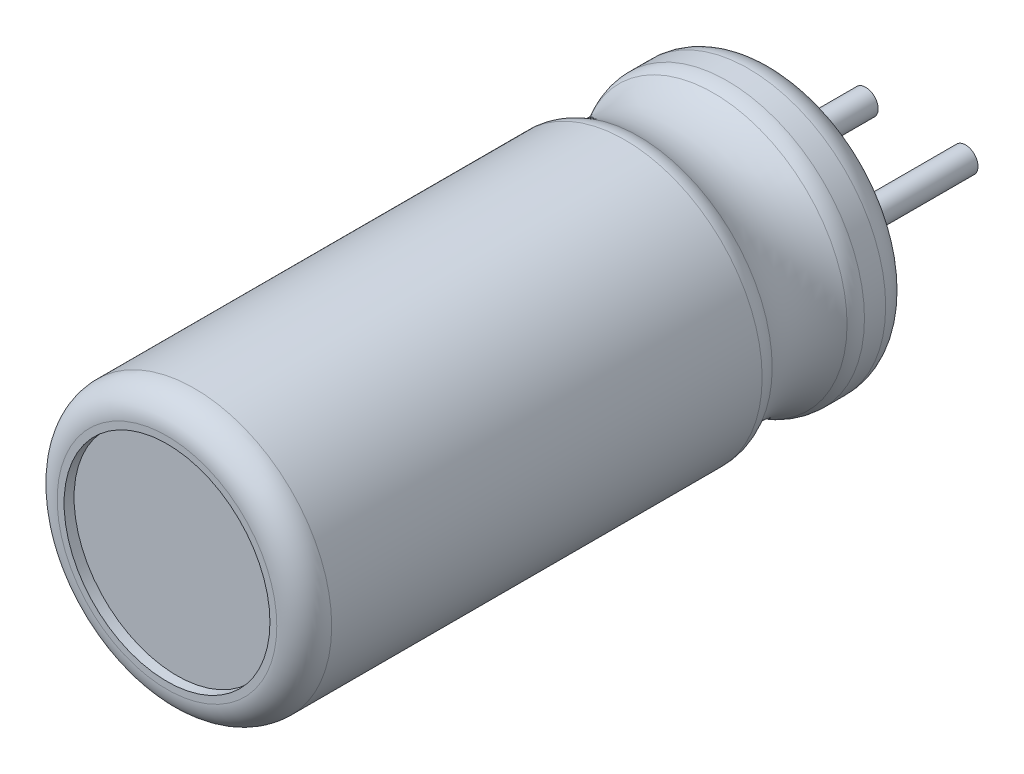
ISO-10303-21;
HEADER;
FILE_DESCRIPTION(('STEP AP214'),'2;1');
FILE_NAME('part.step','',(''),(''),'','','');
FILE_SCHEMA(('AUTOMOTIVE_DESIGN { 1 0 10303 214 1 1 1 1 }'));
ENDSEC;
DATA;
#1=APPLICATION_CONTEXT('core data for automotive mechanical design processes');
#2=APPLICATION_PROTOCOL_DEFINITION('international standard','automotive_design',2000,#1);
#3=PRODUCT_CONTEXT('',#1,'mechanical');
#4=PRODUCT('Part','Part','',(#3));
#5=PRODUCT_RELATED_PRODUCT_CATEGORY('part','',(#4));
#6=PRODUCT_DEFINITION_FORMATION('','',#4);
#7=PRODUCT_DEFINITION_CONTEXT('part definition',#1,'design');
#8=PRODUCT_DEFINITION('design','',#6,#7);
#9=PRODUCT_DEFINITION_SHAPE('','',#8);
#10=(LENGTH_UNIT() NAMED_UNIT(*) SI_UNIT(.MILLI.,.METRE.));
#11=(NAMED_UNIT(*) PLANE_ANGLE_UNIT() SI_UNIT($,.RADIAN.));
#12=(NAMED_UNIT(*) SI_UNIT($,.STERADIAN.) SOLID_ANGLE_UNIT());
#13=UNCERTAINTY_MEASURE_WITH_UNIT(LENGTH_MEASURE(1.E-05),#10,'distance_accuracy_value','');
#14=(GEOMETRIC_REPRESENTATION_CONTEXT(3) GLOBAL_UNCERTAINTY_ASSIGNED_CONTEXT((#13)) GLOBAL_UNIT_ASSIGNED_CONTEXT((#10,
#11,#12)) REPRESENTATION_CONTEXT('',''));
#15=CARTESIAN_POINT('',(0.,0.,0.));
#16=DIRECTION('',(0.,0.,1.));
#17=DIRECTION('',(1.,0.,0.));
#18=AXIS2_PLACEMENT_3D('',#15,#16,#17);
#19=CARTESIAN_POINT('',(0.,0.,0.));
#20=DIRECTION('',(0.,0.,1.));
#21=DIRECTION('',(1.,0.,0.));
#22=AXIS2_PLACEMENT_3D('',#19,#20,#21);
#23=PLANE('',#22);
#24=DIRECTION('',(0.,1.,0.));
#25=VECTOR('',#24,1.);
#26=CARTESIAN_POINT('',(0.229166666663365,0.,0.));
#27=LINE('',#26,#25);
#28=CARTESIAN_POINT('',(0.229166666665022,1.79795408419992,0.));
#29=VERTEX_POINT('',#28);
#30=CARTESIAN_POINT('',(0.229166666665021,0.669203235791981,0.));
#31=VERTEX_POINT('',#30);
#32=EDGE_CURVE('P0_E115',#29,#31,#27,.F.);
#33=ORIENTED_EDGE('',*,*,#32,.F.);
#34=CARTESIAN_POINT('',(0.,0.,0.));
#35=DIRECTION('',(0.,0.,-1.));
#36=DIRECTION('',(-1.,0.,0.));
#37=AXIS2_PLACEMENT_3D('',#34,#35,#36);
#38=CIRCLE('',#37,1.8125);
#39=CARTESIAN_POINT('',(0.229166666663365,-1.79795408419971,0.));
#40=VERTEX_POINT('',#39);
#41=EDGE_CURVE('P0_E294',#40,#29,#38,.F.);
#42=ORIENTED_EDGE('',*,*,#41,.F.);
#43=DIRECTION('',(0.,1.,0.));
#44=VECTOR('',#43,1.);
#45=CARTESIAN_POINT('',(0.229166666666678,-1.79795408425211,0.));
#46=LINE('',#45,#44);
#47=CARTESIAN_POINT('',(0.229166666666678,-0.669203235791843,0.));
#48=VERTEX_POINT('',#47);
#49=EDGE_CURVE('P0_E298',#48,#40,#46,.F.);
#50=ORIENTED_EDGE('',*,*,#49,.F.);
#51=CARTESIAN_POINT('',(0.,2.07123151783556,0.));
#52=DIRECTION('',(0.,0.,1.));
#53=DIRECTION('',(1.,0.,0.));
#54=AXIS2_PLACEMENT_3D('',#51,#52,#53);
#55=CIRCLE('',#54,2.75);
#56=CARTESIAN_POINT('',(1.19565217379121,-0.405240949063344,0.));
#57=VERTEX_POINT('',#56);
#58=EDGE_CURVE('P0_E304',#48,#57,#55,.T.);
#59=ORIENTED_EDGE('',*,*,#58,.T.);
#60=CARTESIAN_POINT('',(1.,0.,0.));
#61=DIRECTION('',(0.,0.,1.));
#62=DIRECTION('',(1.,0.,0.));
#63=AXIS2_PLACEMENT_3D('',#60,#61,#62);
#64=CIRCLE('',#63,0.45);
#65=CARTESIAN_POINT('',(1.19565217379121,0.405240949063344,0.));
#66=VERTEX_POINT('',#65);
#67=EDGE_CURVE('P0_E140',#57,#66,#64,.T.);
#68=ORIENTED_EDGE('',*,*,#67,.T.);
#69=CARTESIAN_POINT('',(0.,-2.07123151783556,0.));
#70=DIRECTION('',(0.,0.,1.));
#71=DIRECTION('',(1.,0.,0.));
#72=AXIS2_PLACEMENT_3D('',#69,#70,#71);
#73=CIRCLE('',#72,2.75);
#74=EDGE_CURVE('P0_E126',#31,#66,#73,.F.);
#75=ORIENTED_EDGE('',*,*,#74,.F.);
#76=EDGE_LOOP('',(#33,#42,#50,#59,#68,#75));
#77=FACE_BOUND('',#76,.T.);
#78=ADVANCED_FACE('P0_F16',(#77),#23,.F.);
#79=CARTESIAN_POINT('',(0.,0.,0.));
#80=DIRECTION('',(0.,0.,1.));
#81=DIRECTION('',(1.,0.,0.));
#82=AXIS2_PLACEMENT_3D('',#79,#80,#81);
#83=PLANE('',#82);
#84=CARTESIAN_POINT('',(-1.,0.,0.));
#85=DIRECTION('',(0.,0.,1.));
#86=DIRECTION('',(1.,0.,0.));
#87=AXIS2_PLACEMENT_3D('',#84,#85,#86);
#88=CIRCLE('',#87,0.45);
#89=CARTESIAN_POINT('',(-1.19565217381368,-0.405240949109878,0.));
#90=VERTEX_POINT('',#89);
#91=CARTESIAN_POINT('',(-1.19565217381368,0.405240949109878,0.));
#92=VERTEX_POINT('',#91);
#93=EDGE_CURVE('P0_E341',#90,#92,#88,.F.);
#94=ORIENTED_EDGE('',*,*,#93,.F.);
#95=CARTESIAN_POINT('',(0.,2.07123151783556,0.));
#96=DIRECTION('',(0.,0.,1.));
#97=DIRECTION('',(1.,0.,0.));
#98=AXIS2_PLACEMENT_3D('',#95,#96,#97);
#99=CIRCLE('',#98,2.75);
#100=CARTESIAN_POINT('',(-0.229166666664999,-0.669203235791983,0.));
#101=VERTEX_POINT('',#100);
#102=EDGE_CURVE('P0_E144',#101,#90,#99,.F.);
#103=ORIENTED_EDGE('',*,*,#102,.F.);
#104=DIRECTION('',(0.,1.,0.));
#105=VECTOR('',#104,1.);
#106=CARTESIAN_POINT('',(-0.229166666663342,0.,0.));
#107=LINE('',#106,#105);
#108=CARTESIAN_POINT('',(-0.229166666664999,-1.79795408419992,0.));
#109=VERTEX_POINT('',#108);
#110=EDGE_CURVE('P0_E142',#109,#101,#107,.T.);
#111=ORIENTED_EDGE('',*,*,#110,.F.);
#112=CARTESIAN_POINT('',(0.,0.,0.));
#113=DIRECTION('',(0.,0.,-1.));
#114=DIRECTION('',(-1.,0.,0.));
#115=AXIS2_PLACEMENT_3D('',#112,#113,#114);
#116=CIRCLE('',#115,1.8125);
#117=CARTESIAN_POINT('',(-0.229166666663342,1.79795408419971,0.));
#118=VERTEX_POINT('',#117);
#119=EDGE_CURVE('P0_E288',#118,#109,#116,.F.);
#120=ORIENTED_EDGE('',*,*,#119,.F.);
#121=DIRECTION('',(0.,1.,0.));
#122=VECTOR('',#121,1.);
#123=CARTESIAN_POINT('',(-0.229166666666655,1.79795408425211,0.));
#124=LINE('',#123,#122);
#125=CARTESIAN_POINT('',(-0.229166666666655,0.669203235791845,0.));
#126=VERTEX_POINT('',#125);
#127=EDGE_CURVE('P0_E136',#126,#118,#124,.T.);
#128=ORIENTED_EDGE('',*,*,#127,.F.);
#129=CARTESIAN_POINT('',(0.,-2.07123151783556,0.));
#130=DIRECTION('',(0.,0.,1.));
#131=DIRECTION('',(1.,0.,0.));
#132=AXIS2_PLACEMENT_3D('',#129,#130,#131);
#133=CIRCLE('',#132,2.75);
#134=EDGE_CURVE('P0_E340',#92,#126,#133,.F.);
#135=ORIENTED_EDGE('',*,*,#134,.F.);
#136=EDGE_LOOP('',(#94,#103,#111,#120,#128,#135));
#137=FACE_BOUND('',#136,.T.);
#138=ADVANCED_FACE('P0_F355',(#137),#83,.F.);
#139=CARTESIAN_POINT('',(1.,0.,1.));
#140=DIRECTION('',(0.,0.,1.));
#141=DIRECTION('',(1.,0.,0.));
#142=AXIS2_PLACEMENT_3D('',#139,#140,#141);
#143=CYLINDRICAL_SURFACE('',#142,0.45);
#144=DIRECTION('',(0.,0.,1.));
#145=VECTOR('',#144,1.);
#146=CARTESIAN_POINT('',(1.19565217372311,0.405240949096225,1.));
#147=LINE('',#146,#145);
#148=CARTESIAN_POINT('',(1.19565217381368,0.405240949109878,1.));
#149=VERTEX_POINT('',#148);
#150=EDGE_CURVE('P0_E137',#149,#66,#147,.F.);
#151=ORIENTED_EDGE('',*,*,#150,.T.);
#152=ORIENTED_EDGE('',*,*,#67,.F.);
#153=DIRECTION('',(0.,0.,1.));
#154=VECTOR('',#153,1.);
#155=CARTESIAN_POINT('',(1.19565217372311,-0.405240949096225,1.));
#156=LINE('',#155,#154);
#157=CARTESIAN_POINT('',(1.19565217379121,-0.405240949063344,1.));
#158=VERTEX_POINT('',#157);
#159=EDGE_CURVE('P0_E302',#57,#158,#156,.T.);
#160=ORIENTED_EDGE('',*,*,#159,.T.);
#161=CARTESIAN_POINT('',(1.,0.,1.));
#162=DIRECTION('',(0.,0.,1.));
#163=DIRECTION('',(1.,0.,0.));
#164=AXIS2_PLACEMENT_3D('',#161,#162,#163);
#165=CIRCLE('',#164,0.45);
#166=EDGE_CURVE('P0_E277',#149,#158,#165,.F.);
#167=ORIENTED_EDGE('',*,*,#166,.F.);
#168=EDGE_LOOP('',(#151,#152,#160,#167));
#169=FACE_BOUND('',#168,.T.);
#170=ADVANCED_FACE('P0_F535',(#169),#143,.F.);
#171=CARTESIAN_POINT('',(0.,2.07123151783556,1.));
#172=DIRECTION('',(0.,0.,1.));
#173=DIRECTION('',(1.,0.,0.));
#174=AXIS2_PLACEMENT_3D('',#171,#172,#173);
#175=CYLINDRICAL_SURFACE('',#174,2.75);
#176=ORIENTED_EDGE('',*,*,#159,.F.);
#177=ORIENTED_EDGE('',*,*,#58,.F.);
#178=DIRECTION('',(0.,0.,1.));
#179=VECTOR('',#178,1.);
#180=CARTESIAN_POINT('',(0.229166666666678,-0.669203235791843,1.));
#181=LINE('',#180,#179);
#182=CARTESIAN_POINT('',(0.229166666666678,-0.669203235791843,1.));
#183=VERTEX_POINT('',#182);
#184=EDGE_CURVE('P0_E299',#183,#48,#181,.F.);
#185=ORIENTED_EDGE('',*,*,#184,.F.);
#186=CARTESIAN_POINT('',(0.,2.07123151783556,1.));
#187=DIRECTION('',(0.,0.,1.));
#188=DIRECTION('',(1.,0.,0.));
#189=AXIS2_PLACEMENT_3D('',#186,#187,#188);
#190=CIRCLE('',#189,2.75);
#191=EDGE_CURVE('P0_E274',#158,#183,#190,.F.);
#192=ORIENTED_EDGE('',*,*,#191,.F.);
#193=EDGE_LOOP('',(#176,#177,#185,#192));
#194=FACE_BOUND('',#193,.T.);
#195=ADVANCED_FACE('P0_F525',(#194),#175,.F.);
#196=CARTESIAN_POINT('',(0.229166666666678,-1.79795408425211,1.));
#197=DIRECTION('',(-1.,0.,0.));
#198=DIRECTION('',(0.,0.,1.));
#199=AXIS2_PLACEMENT_3D('',#196,#197,#198);
#200=PLANE('',#199);
#201=ORIENTED_EDGE('',*,*,#49,.T.);
#202=DIRECTION('',(0.,0.,-1.));
#203=VECTOR('',#202,1.);
#204=CARTESIAN_POINT('',(0.229166666660052,-1.79795408420013,1.));
#205=LINE('',#204,#203);
#206=CARTESIAN_POINT('',(0.229166666663365,-1.79795408419971,1.));
#207=VERTEX_POINT('',#206);
#208=EDGE_CURVE('P0_E295',#207,#40,#205,.T.);
#209=ORIENTED_EDGE('',*,*,#208,.F.);
#210=DIRECTION('',(0.,1.,0.));
#211=VECTOR('',#210,1.);
#212=CARTESIAN_POINT('',(0.229166666666678,0.,1.));
#213=LINE('',#212,#211);
#214=EDGE_CURVE('P0_E271',#183,#207,#213,.F.);
#215=ORIENTED_EDGE('',*,*,#214,.F.);
#216=ORIENTED_EDGE('',*,*,#184,.T.);
#217=EDGE_LOOP('',(#201,#209,#215,#216));
#218=FACE_BOUND('',#217,.T.);
#219=ADVANCED_FACE('P0_F515',(#218),#200,.T.);
#220=CARTESIAN_POINT('',(0.,0.,1.));
#221=DIRECTION('',(0.,0.,-1.));
#222=DIRECTION('',(-1.,0.,0.));
#223=AXIS2_PLACEMENT_3D('',#220,#221,#222);
#224=CYLINDRICAL_SURFACE('',#223,1.8125);
#225=ORIENTED_EDGE('',*,*,#41,.T.);
#226=DIRECTION('',(0.,0.,1.));
#227=VECTOR('',#226,1.);
#228=CARTESIAN_POINT('',(0.229166666666678,1.79795408420013,1.));
#229=LINE('',#228,#227);
#230=CARTESIAN_POINT('',(0.229166666663366,1.79795408420013,1.));
#231=VERTEX_POINT('',#230);
#232=EDGE_CURVE('P0_E121',#231,#29,#229,.F.);
#233=ORIENTED_EDGE('',*,*,#232,.F.);
#234=CARTESIAN_POINT('',(0.,0.,1.));
#235=DIRECTION('',(0.,0.,-1.));
#236=DIRECTION('',(-1.,0.,0.));
#237=AXIS2_PLACEMENT_3D('',#234,#235,#236);
#238=CIRCLE('',#237,1.8125);
#239=EDGE_CURVE('P0_E270',#207,#231,#238,.F.);
#240=ORIENTED_EDGE('',*,*,#239,.F.);
#241=ORIENTED_EDGE('',*,*,#208,.T.);
#242=EDGE_LOOP('',(#225,#233,#240,#241));
#243=FACE_BOUND('',#242,.T.);
#244=ADVANCED_FACE('P0_F506',(#243),#224,.T.);
#245=CARTESIAN_POINT('',(0.229166666666678,0.669203235791843,1.));
#246=DIRECTION('',(-1.,0.,0.));
#247=DIRECTION('',(0.,0.,1.));
#248=AXIS2_PLACEMENT_3D('',#245,#246,#247);
#249=PLANE('',#248);
#250=ORIENTED_EDGE('',*,*,#32,.T.);
#251=DIRECTION('',(0.,0.,1.));
#252=VECTOR('',#251,1.);
#253=CARTESIAN_POINT('',(0.229166666666678,0.669203235791843,1.));
#254=LINE('',#253,#252);
#255=CARTESIAN_POINT('',(0.229166666663365,0.66920323579212,1.));
#256=VERTEX_POINT('',#255);
#257=EDGE_CURVE('P0_E119',#31,#256,#254,.T.);
#258=ORIENTED_EDGE('',*,*,#257,.T.);
#259=DIRECTION('',(0.,1.,0.));
#260=VECTOR('',#259,1.);
#261=CARTESIAN_POINT('',(0.229166666660053,0.,1.));
#262=LINE('',#261,#260);
#263=EDGE_CURVE('P0_E268',#231,#256,#262,.F.);
#264=ORIENTED_EDGE('',*,*,#263,.F.);
#265=ORIENTED_EDGE('',*,*,#232,.T.);
#266=EDGE_LOOP('',(#250,#258,#264,#265));
#267=FACE_BOUND('',#266,.T.);
#268=ADVANCED_FACE('P0_F117',(#267),#249,.T.);
#269=CARTESIAN_POINT('',(0.,-2.07123151783556,1.));
#270=DIRECTION('',(0.,0.,1.));
#271=DIRECTION('',(1.,0.,0.));
#272=AXIS2_PLACEMENT_3D('',#269,#270,#271);
#273=CYLINDRICAL_SURFACE('',#272,2.75);
#274=ORIENTED_EDGE('',*,*,#257,.F.);
#275=ORIENTED_EDGE('',*,*,#74,.T.);
#276=ORIENTED_EDGE('',*,*,#150,.F.);
#277=CARTESIAN_POINT('',(0.,-2.07123151783556,1.));
#278=DIRECTION('',(0.,0.,1.));
#279=DIRECTION('',(1.,0.,0.));
#280=AXIS2_PLACEMENT_3D('',#277,#278,#279);
#281=CIRCLE('',#280,2.75);
#282=EDGE_CURVE('P0_E134',#256,#149,#281,.F.);
#283=ORIENTED_EDGE('',*,*,#282,.F.);
#284=EDGE_LOOP('',(#274,#275,#276,#283));
#285=FACE_BOUND('',#284,.T.);
#286=ADVANCED_FACE('P0_F130',(#285),#273,.F.);
#287=CARTESIAN_POINT('',(-0.229166666666655,1.79795408425211,1.));
#288=DIRECTION('',(1.,0.,0.));
#289=DIRECTION('',(0.,0.,-1.));
#290=AXIS2_PLACEMENT_3D('',#287,#288,#289);
#291=PLANE('',#290);
#292=ORIENTED_EDGE('',*,*,#127,.T.);
#293=DIRECTION('',(0.,0.,-1.));
#294=VECTOR('',#293,1.);
#295=CARTESIAN_POINT('',(-0.22916666666003,1.79795408420013,1.));
#296=LINE('',#295,#294);
#297=CARTESIAN_POINT('',(-0.229166666663342,1.79795408419971,1.));
#298=VERTEX_POINT('',#297);
#299=EDGE_CURVE('P0_E289',#298,#118,#296,.T.);
#300=ORIENTED_EDGE('',*,*,#299,.F.);
#301=DIRECTION('',(0.,1.,0.));
#302=VECTOR('',#301,1.);
#303=CARTESIAN_POINT('',(-0.229166666666655,0.,1.));
#304=LINE('',#303,#302);
#305=CARTESIAN_POINT('',(-0.229166666666655,0.669203235791845,1.));
#306=VERTEX_POINT('',#305);
#307=EDGE_CURVE('P0_E265',#306,#298,#304,.T.);
#308=ORIENTED_EDGE('',*,*,#307,.F.);
#309=DIRECTION('',(0.,0.,1.));
#310=VECTOR('',#309,1.);
#311=CARTESIAN_POINT('',(-0.229166666666655,0.669203235791845,1.));
#312=LINE('',#311,#310);
#313=EDGE_CURVE('P0_E278',#306,#126,#312,.F.);
#314=ORIENTED_EDGE('',*,*,#313,.T.);
#315=EDGE_LOOP('',(#292,#300,#308,#314));
#316=FACE_BOUND('',#315,.T.);
#317=ADVANCED_FACE('P0_F372',(#316),#291,.T.);
#318=CARTESIAN_POINT('',(0.,0.,1.));
#319=DIRECTION('',(0.,0.,-1.));
#320=DIRECTION('',(-1.,0.,0.));
#321=AXIS2_PLACEMENT_3D('',#318,#319,#320);
#322=CYLINDRICAL_SURFACE('',#321,1.8125);
#323=ORIENTED_EDGE('',*,*,#119,.T.);
#324=DIRECTION('',(0.,0.,-1.));
#325=VECTOR('',#324,1.);
#326=CARTESIAN_POINT('',(-0.229166666666655,-1.79795408420013,1.));
#327=LINE('',#326,#325);
#328=CARTESIAN_POINT('',(-0.229166666663342,-1.79795408420013,1.));
#329=VERTEX_POINT('',#328);
#330=EDGE_CURVE('P0_E285',#329,#109,#327,.T.);
#331=ORIENTED_EDGE('',*,*,#330,.F.);
#332=CARTESIAN_POINT('',(0.,0.,1.));
#333=DIRECTION('',(0.,0.,-1.));
#334=DIRECTION('',(-1.,0.,0.));
#335=AXIS2_PLACEMENT_3D('',#332,#333,#334);
#336=CIRCLE('',#335,1.8125);
#337=EDGE_CURVE('P0_E264',#298,#329,#336,.F.);
#338=ORIENTED_EDGE('',*,*,#337,.F.);
#339=ORIENTED_EDGE('',*,*,#299,.T.);
#340=EDGE_LOOP('',(#323,#331,#338,#339));
#341=FACE_BOUND('',#340,.T.);
#342=ADVANCED_FACE('P0_F370',(#341),#322,.T.);
#343=CARTESIAN_POINT('',(-0.229166666666655,-0.669203235791845,1.));
#344=DIRECTION('',(1.,0.,0.));
#345=DIRECTION('',(0.,0.,-1.));
#346=AXIS2_PLACEMENT_3D('',#343,#344,#345);
#347=PLANE('',#346);
#348=ORIENTED_EDGE('',*,*,#110,.T.);
#349=DIRECTION('',(0.,0.,1.));
#350=VECTOR('',#349,1.);
#351=CARTESIAN_POINT('',(-0.229166666666656,-0.669203235791845,1.));
#352=LINE('',#351,#350);
#353=CARTESIAN_POINT('',(-0.229166666663343,-0.669203235792122,1.));
#354=VERTEX_POINT('',#353);
#355=EDGE_CURVE('P0_E283',#101,#354,#352,.T.);
#356=ORIENTED_EDGE('',*,*,#355,.T.);
#357=DIRECTION('',(0.,1.,0.));
#358=VECTOR('',#357,1.);
#359=CARTESIAN_POINT('',(-0.229166666660029,0.,1.));
#360=LINE('',#359,#358);
#361=EDGE_CURVE('P0_E255',#329,#354,#360,.T.);
#362=ORIENTED_EDGE('',*,*,#361,.F.);
#363=ORIENTED_EDGE('',*,*,#330,.T.);
#364=EDGE_LOOP('',(#348,#356,#362,#363));
#365=FACE_BOUND('',#364,.T.);
#366=ADVANCED_FACE('P0_F368',(#365),#347,.T.);
#367=CARTESIAN_POINT('',(0.,2.07123151783556,1.));
#368=DIRECTION('',(0.,0.,1.));
#369=DIRECTION('',(1.,0.,0.));
#370=AXIS2_PLACEMENT_3D('',#367,#368,#369);
#371=CYLINDRICAL_SURFACE('',#370,2.75);
#372=ORIENTED_EDGE('',*,*,#355,.F.);
#373=ORIENTED_EDGE('',*,*,#102,.T.);
#374=DIRECTION('',(0.,0.,1.));
#375=VECTOR('',#374,1.);
#376=CARTESIAN_POINT('',(-1.19565217376805,-0.405240949189292,1.));
#377=LINE('',#376,#375);
#378=CARTESIAN_POINT('',(-1.19565217383615,-0.405240949156412,1.));
#379=VERTEX_POINT('',#378);
#380=EDGE_CURVE('P0_E281',#90,#379,#377,.T.);
#381=ORIENTED_EDGE('',*,*,#380,.T.);
#382=CARTESIAN_POINT('',(0.,2.07123151783556,1.));
#383=DIRECTION('',(0.,0.,1.));
#384=DIRECTION('',(1.,0.,0.));
#385=AXIS2_PLACEMENT_3D('',#382,#383,#384);
#386=CIRCLE('',#385,2.75);
#387=EDGE_CURVE('P0_E263',#354,#379,#386,.F.);
#388=ORIENTED_EDGE('',*,*,#387,.F.);
#389=EDGE_LOOP('',(#372,#373,#381,#388));
#390=FACE_BOUND('',#389,.T.);
#391=ADVANCED_FACE('P0_F349',(#390),#371,.F.);
#392=CARTESIAN_POINT('',(-1.,0.,1.));
#393=DIRECTION('',(0.,0.,1.));
#394=DIRECTION('',(1.,0.,0.));
#395=AXIS2_PLACEMENT_3D('',#392,#393,#394);
#396=CYLINDRICAL_SURFACE('',#395,0.45);
#397=ORIENTED_EDGE('',*,*,#380,.F.);
#398=ORIENTED_EDGE('',*,*,#93,.T.);
#399=DIRECTION('',(0.,0.,1.));
#400=VECTOR('',#399,1.);
#401=CARTESIAN_POINT('',(-1.19565217372311,0.405240949096224,1.));
#402=LINE('',#401,#400);
#403=CARTESIAN_POINT('',(-1.19565217379122,0.405240949063344,1.));
#404=VERTEX_POINT('',#403);
#405=EDGE_CURVE('P0_E275',#92,#404,#402,.T.);
#406=ORIENTED_EDGE('',*,*,#405,.T.);
#407=CARTESIAN_POINT('',(-1.,0.,1.));
#408=DIRECTION('',(0.,0.,1.));
#409=DIRECTION('',(1.,0.,0.));
#410=AXIS2_PLACEMENT_3D('',#407,#408,#409);
#411=CIRCLE('',#410,0.45);
#412=EDGE_CURVE('P0_E321',#379,#404,#411,.F.);
#413=ORIENTED_EDGE('',*,*,#412,.F.);
#414=EDGE_LOOP('',(#397,#398,#406,#413));
#415=FACE_BOUND('',#414,.T.);
#416=ADVANCED_FACE('P0_F353',(#415),#396,.F.);
#417=CARTESIAN_POINT('',(0.,-2.07123151783556,1.));
#418=DIRECTION('',(0.,0.,1.));
#419=DIRECTION('',(1.,0.,0.));
#420=AXIS2_PLACEMENT_3D('',#417,#418,#419);
#421=CYLINDRICAL_SURFACE('',#420,2.75);
#422=ORIENTED_EDGE('',*,*,#405,.F.);
#423=ORIENTED_EDGE('',*,*,#134,.T.);
#424=ORIENTED_EDGE('',*,*,#313,.F.);
#425=CARTESIAN_POINT('',(0.,-2.07123151783556,1.));
#426=DIRECTION('',(0.,0.,1.));
#427=DIRECTION('',(1.,0.,0.));
#428=AXIS2_PLACEMENT_3D('',#425,#426,#427);
#429=CIRCLE('',#428,2.75);
#430=EDGE_CURVE('P0_E318',#404,#306,#429,.F.);
#431=ORIENTED_EDGE('',*,*,#430,.F.);
#432=EDGE_LOOP('',(#422,#423,#424,#431));
#433=FACE_BOUND('',#432,.T.);
#434=ADVANCED_FACE('P0_F360',(#433),#421,.F.);
#435=CARTESIAN_POINT('',(0.,0.,1.));
#436=DIRECTION('',(0.,0.,-1.));
#437=DIRECTION('',(-1.,0.,0.));
#438=AXIS2_PLACEMENT_3D('',#435,#436,#437);
#439=PLANE('',#438);
#440=ORIENTED_EDGE('',*,*,#412,.T.);
#441=ORIENTED_EDGE('',*,*,#430,.T.);
#442=ORIENTED_EDGE('',*,*,#307,.T.);
#443=ORIENTED_EDGE('',*,*,#337,.T.);
#444=ORIENTED_EDGE('',*,*,#361,.T.);
#445=ORIENTED_EDGE('',*,*,#387,.T.);
#446=EDGE_LOOP('',(#440,#441,#442,#443,#444,#445));
#447=FACE_BOUND('',#446,.T.);
#448=ORIENTED_EDGE('',*,*,#263,.T.);
#449=ORIENTED_EDGE('',*,*,#282,.T.);
#450=ORIENTED_EDGE('',*,*,#166,.T.);
#451=ORIENTED_EDGE('',*,*,#191,.T.);
#452=ORIENTED_EDGE('',*,*,#214,.T.);
#453=ORIENTED_EDGE('',*,*,#239,.T.);
#454=EDGE_LOOP('',(#448,#449,#450,#451,#452,#453));
#455=FACE_BOUND('',#454,.T.);
#456=CARTESIAN_POINT('',(0.,0.,1.));
#457=DIRECTION('',(0.,0.,1.));
#458=DIRECTION('',(1.,0.,0.));
#459=AXIS2_PLACEMENT_3D('',#456,#457,#458);
#460=CIRCLE('',#459,2.0625);
#461=CARTESIAN_POINT('',(2.0625,0.,1.));
#462=VERTEX_POINT('',#461);
#463=EDGE_CURVE('P0_E315',#462,#462,#460,.F.);
#464=ORIENTED_EDGE('',*,*,#463,.T.);
#465=EDGE_LOOP('',(#464));
#466=FACE_BOUND('',#465,.T.);
#467=ADVANCED_FACE('P0_F363',(#447,#455,#466),#439,.T.);
#468=CARTESIAN_POINT('',(0.,0.,1.));
#469=DIRECTION('',(0.,0.,1.));
#470=DIRECTION('',(1.,0.,0.));
#471=AXIS2_PLACEMENT_3D('',#468,#469,#470);
#472=CYLINDRICAL_SURFACE('',#471,2.0625);
#473=CARTESIAN_POINT('',(0.,0.,0.300000000000001));
#474=DIRECTION('',(0.,0.,1.));
#475=DIRECTION('',(1.,0.,0.));
#476=AXIS2_PLACEMENT_3D('',#473,#474,#475);
#477=CIRCLE('',#476,2.0625);
#478=CARTESIAN_POINT('',(2.0625,0.,0.300000000000001));
#479=VERTEX_POINT('',#478);
#480=EDGE_CURVE('P0_E312',#479,#479,#477,.T.);
#481=ORIENTED_EDGE('',*,*,#480,.F.);
#482=EDGE_LOOP('',(#481));
#483=FACE_BOUND('',#482,.T.);
#484=ORIENTED_EDGE('',*,*,#463,.F.);
#485=EDGE_LOOP('',(#484));
#486=FACE_BOUND('',#485,.T.);
#487=ADVANCED_FACE('P0_F443',(#483,#486),#472,.F.);
#488=CARTESIAN_POINT('',(0.,0.,0.300000000000001));
#489=DIRECTION('',(0.,0.,-1.));
#490=DIRECTION('',(-1.,0.,0.));
#491=AXIS2_PLACEMENT_3D('',#488,#489,#490);
#492=PLANE('',#491);
#493=ORIENTED_EDGE('',*,*,#480,.T.);
#494=EDGE_LOOP('',(#493));
#495=FACE_BOUND('',#494,.T.);
#496=CARTESIAN_POINT('',(0.,0.,0.3));
#497=DIRECTION('',(0.,0.,1.));
#498=DIRECTION('',(0.866025403784438,0.500000000000001,0.));
#499=AXIS2_PLACEMENT_3D('',#496,#497,#498);
#500=CIRCLE('',#499,2.2);
#501=CARTESIAN_POINT('',(1.90525588832576,1.1,0.3));
#502=VERTEX_POINT('',#501);
#503=CARTESIAN_POINT('',(1.90525588832576,-1.1,0.3));
#504=VERTEX_POINT('',#503);
#505=EDGE_CURVE('P0_E240',#502,#504,#500,.T.);
#506=ORIENTED_EDGE('',*,*,#505,.F.);
#507=CARTESIAN_POINT('',(0.,0.,0.3));
#508=DIRECTION('',(0.,0.,1.));
#509=DIRECTION('',(0.866025403784438,-0.500000000000001,0.));
#510=AXIS2_PLACEMENT_3D('',#507,#508,#509);
#511=CIRCLE('',#510,2.2);
#512=EDGE_CURVE('P0_E212',#504,#502,#511,.T.);
#513=ORIENTED_EDGE('',*,*,#512,.F.);
#514=EDGE_LOOP('',(#506,#513));
#515=FACE_BOUND('',#514,.T.);
#516=ADVANCED_FACE('P0_F227',(#495,#515),#492,.T.);
#517=CARTESIAN_POINT('',(0.,0.,0.85));
#518=DIRECTION('',(0.,0.,1.));
#519=DIRECTION('',(1.,0.,0.));
#520=AXIS2_PLACEMENT_3D('',#517,#518,#519);
#521=TOROIDAL_SURFACE('',#520,2.2,0.55);
#522=ORIENTED_EDGE('',*,*,#505,.T.);
#523=ORIENTED_EDGE('',*,*,#512,.T.);
#524=EDGE_LOOP('',(#522,#523));
#525=FACE_BOUND('',#524,.T.);
#526=CARTESIAN_POINT('',(0.,0.,0.85));
#527=DIRECTION('',(0.,0.,1.));
#528=DIRECTION('',(1.,0.,0.));
#529=AXIS2_PLACEMENT_3D('',#526,#527,#528);
#530=CIRCLE('',#529,2.75);
#531=CARTESIAN_POINT('',(2.75,0.,0.85));
#532=VERTEX_POINT('',#531);
#533=EDGE_CURVE('P0_E236',#532,#532,#530,.T.);
#534=ORIENTED_EDGE('',*,*,#533,.F.);
#535=EDGE_LOOP('',(#534));
#536=FACE_BOUND('',#535,.T.);
#537=ADVANCED_FACE('P0_F216',(#525,#536),#521,.T.);
#538=CARTESIAN_POINT('',(0.,0.,12.3));
#539=DIRECTION('',(0.,0.,1.));
#540=DIRECTION('',(1.,0.,0.));
#541=AXIS2_PLACEMENT_3D('',#538,#539,#540);
#542=PLANE('',#541);
#543=CARTESIAN_POINT('',(0.,0.,12.3));
#544=DIRECTION('',(0.,0.,1.));
#545=DIRECTION('',(1.,0.,0.));
#546=AXIS2_PLACEMENT_3D('',#543,#544,#545);
#547=CIRCLE('',#546,2.0625);
#548=CARTESIAN_POINT('',(2.0625,0.,12.3));
#549=VERTEX_POINT('',#548);
#550=EDGE_CURVE('P0_E239',#549,#549,#547,.T.);
#551=ORIENTED_EDGE('',*,*,#550,.T.);
#552=EDGE_LOOP('',(#551));
#553=FACE_BOUND('',#552,.T.);
#554=ADVANCED_FACE('P0_F226',(#553),#542,.T.);
#555=CARTESIAN_POINT('',(0.,0.,0.85));
#556=DIRECTION('',(0.,0.,1.));
#557=DIRECTION('',(1.,0.,0.));
#558=AXIS2_PLACEMENT_3D('',#555,#556,#557);
#559=CYLINDRICAL_SURFACE('',#558,2.75);
#560=ORIENTED_EDGE('',*,*,#533,.T.);
#561=EDGE_LOOP('',(#560));
#562=FACE_BOUND('',#561,.T.);
#563=CARTESIAN_POINT('',(0.,0.,1.2747523545536));
#564=DIRECTION('',(0.,0.,1.));
#565=DIRECTION('',(1.,0.,0.));
#566=AXIS2_PLACEMENT_3D('',#563,#564,#565);
#567=CIRCLE('',#566,2.75);
#568=CARTESIAN_POINT('',(2.75,0.,1.2747523545536));
#569=VERTEX_POINT('',#568);
#570=EDGE_CURVE('P0_E235',#569,#569,#567,.T.);
#571=ORIENTED_EDGE('',*,*,#570,.F.);
#572=EDGE_LOOP('',(#571));
#573=FACE_BOUND('',#572,.T.);
#574=ADVANCED_FACE('P0_F413',(#562,#573),#559,.T.);
#575=CARTESIAN_POINT('',(0.,0.,12.5));
#576=DIRECTION('',(0.,0.,1.));
#577=DIRECTION('',(1.,0.,0.));
#578=AXIS2_PLACEMENT_3D('',#575,#576,#577);
#579=CYLINDRICAL_SURFACE('',#578,2.0625);
#580=ORIENTED_EDGE('',*,*,#550,.F.);
#581=EDGE_LOOP('',(#580));
#582=FACE_BOUND('',#581,.T.);
#583=CARTESIAN_POINT('',(0.,0.,12.5));
#584=DIRECTION('',(0.,0.,1.));
#585=DIRECTION('',(1.,0.,0.));
#586=AXIS2_PLACEMENT_3D('',#583,#584,#585);
#587=CIRCLE('',#586,2.0625);
#588=CARTESIAN_POINT('',(2.0625,0.,12.5));
#589=VERTEX_POINT('',#588);
#590=EDGE_CURVE('P0_E307',#589,#589,#587,.F.);
#591=ORIENTED_EDGE('',*,*,#590,.F.);
#592=EDGE_LOOP('',(#591));
#593=FACE_BOUND('',#592,.T.);
#594=ADVANCED_FACE('P0_F408',(#582,#593),#579,.F.);
#595=CARTESIAN_POINT('',(0.,0.,1.2747523545536));
#596=DIRECTION('',(0.,0.,1.));
#597=DIRECTION('',(1.,0.,0.));
#598=AXIS2_PLACEMENT_3D('',#595,#596,#597);
#599=TOROIDAL_SURFACE('',#598,2.2,0.55);
#600=ORIENTED_EDGE('',*,*,#570,.T.);
#601=EDGE_LOOP('',(#600));
#602=FACE_BOUND('',#601,.T.);
#603=CARTESIAN_POINT('',(0.,0.,1.55000000009091));
#604=DIRECTION('',(0.,0.,1.));
#605=DIRECTION('',(1.,0.,0.));
#606=AXIS2_PLACEMENT_3D('',#603,#604,#605);
#607=CIRCLE('',#606,2.67617090842389);
#608=CARTESIAN_POINT('',(2.67617090842389,0.,1.55000000009091));
#609=VERTEX_POINT('',#608);
#610=EDGE_CURVE('P0_E177',#609,#609,#607,.F.);
#611=ORIENTED_EDGE('',*,*,#610,.T.);
#612=EDGE_LOOP('',(#611));
#613=FACE_BOUND('',#612,.T.);
#614=ADVANCED_FACE('P0_F195',(#602,#613),#599,.T.);
#615=CARTESIAN_POINT('',(0.,0.,12.5));
#616=DIRECTION('',(0.,0.,1.));
#617=DIRECTION('',(1.,0.,0.));
#618=AXIS2_PLACEMENT_3D('',#615,#616,#617);
#619=PLANE('',#618);
#620=ORIENTED_EDGE('',*,*,#590,.T.);
#621=EDGE_LOOP('',(#620));
#622=FACE_BOUND('',#621,.T.);
#623=CARTESIAN_POINT('',(0.,0.,12.5));
#624=DIRECTION('',(0.,0.,-1.));
#625=DIRECTION('',(0.866025403784441,-0.499999999999996,0.));
#626=AXIS2_PLACEMENT_3D('',#623,#624,#625);
#627=CIRCLE('',#626,2.2);
#628=CARTESIAN_POINT('',(1.90525588832577,-1.09999999999999,12.5));
#629=VERTEX_POINT('',#628);
#630=CARTESIAN_POINT('',(1.90525588832577,1.09999999999999,12.5));
#631=VERTEX_POINT('',#630);
#632=EDGE_CURVE('P0_E180',#629,#631,#627,.T.);
#633=ORIENTED_EDGE('',*,*,#632,.F.);
#634=CARTESIAN_POINT('',(0.,0.,12.5));
#635=DIRECTION('',(0.,0.,-1.));
#636=DIRECTION('',(0.866025403784441,0.499999999999995,0.));
#637=AXIS2_PLACEMENT_3D('',#634,#635,#636);
#638=CIRCLE('',#637,2.2);
#639=EDGE_CURVE('P0_E35',#631,#629,#638,.T.);
#640=ORIENTED_EDGE('',*,*,#639,.F.);
#641=EDGE_LOOP('',(#633,#640));
#642=FACE_BOUND('',#641,.T.);
#643=ADVANCED_FACE('P0_F186',(#622,#642),#619,.T.);
#644=CARTESIAN_POINT('',(0.,0.,2.3));
#645=DIRECTION('',(0.,0.,1.));
#646=DIRECTION('',(1.,0.,0.));
#647=AXIS2_PLACEMENT_3D('',#644,#645,#646);
#648=TOROIDAL_SURFACE('',#647,3.97365042362189,1.49865042362189);
#649=ORIENTED_EDGE('',*,*,#610,.F.);
#650=EDGE_LOOP('',(#649));
#651=FACE_BOUND('',#650,.T.);
#652=CARTESIAN_POINT('',(0.,0.,3.05000000009247));
#653=DIRECTION('',(0.,0.,1.));
#654=DIRECTION('',(1.,0.,0.));
#655=AXIS2_PLACEMENT_3D('',#652,#653,#654);
#656=CIRCLE('',#655,2.67617090810666);
#657=CARTESIAN_POINT('',(2.67617090810666,0.,3.05000000009247));
#658=VERTEX_POINT('',#657);
#659=EDGE_CURVE('P0_E395',#658,#658,#656,.T.);
#660=ORIENTED_EDGE('',*,*,#659,.F.);
#661=EDGE_LOOP('',(#660));
#662=FACE_BOUND('',#661,.T.);
#663=ADVANCED_FACE('P0_F167',(#651,#662),#648,.F.);
#664=CARTESIAN_POINT('',(0.,0.,11.95));
#665=DIRECTION('',(0.,0.,1.));
#666=DIRECTION('',(1.,0.,0.));
#667=AXIS2_PLACEMENT_3D('',#664,#665,#666);
#668=TOROIDAL_SURFACE('',#667,2.2,0.55);
#669=ORIENTED_EDGE('',*,*,#639,.T.);
#670=ORIENTED_EDGE('',*,*,#632,.T.);
#671=EDGE_LOOP('',(#669,#670));
#672=FACE_BOUND('',#671,.T.);
#673=CARTESIAN_POINT('',(0.,0.,11.95));
#674=DIRECTION('',(0.,0.,1.));
#675=DIRECTION('',(1.,0.,0.));
#676=AXIS2_PLACEMENT_3D('',#673,#674,#675);
#677=CIRCLE('',#676,2.75);
#678=CARTESIAN_POINT('',(2.75,0.,11.95));
#679=VERTEX_POINT('',#678);
#680=EDGE_CURVE('P0_E27',#679,#679,#677,.F.);
#681=ORIENTED_EDGE('',*,*,#680,.F.);
#682=EDGE_LOOP('',(#681));
#683=FACE_BOUND('',#682,.T.);
#684=ADVANCED_FACE('P0_F155',(#672,#683),#668,.T.);
#685=CARTESIAN_POINT('',(0.,0.,3.3252476454464));
#686=DIRECTION('',(0.,0.,1.));
#687=DIRECTION('',(1.,0.,0.));
#688=AXIS2_PLACEMENT_3D('',#685,#686,#687);
#689=TOROIDAL_SURFACE('',#688,2.2,0.55);
#690=ORIENTED_EDGE('',*,*,#659,.T.);
#691=EDGE_LOOP('',(#690));
#692=FACE_BOUND('',#691,.T.);
#693=CARTESIAN_POINT('',(0.,0.,3.3252476454464));
#694=DIRECTION('',(0.,0.,1.));
#695=DIRECTION('',(1.,0.,0.));
#696=AXIS2_PLACEMENT_3D('',#693,#694,#695);
#697=CIRCLE('',#696,2.75);
#698=CARTESIAN_POINT('',(2.75,0.,3.3252476454464));
#699=VERTEX_POINT('',#698);
#700=EDGE_CURVE('P0_E10',#699,#699,#697,.T.);
#701=ORIENTED_EDGE('',*,*,#700,.F.);
#702=EDGE_LOOP('',(#701));
#703=FACE_BOUND('',#702,.T.);
#704=ADVANCED_FACE('P0_F166',(#692,#703),#689,.T.);
#705=CARTESIAN_POINT('',(0.,0.,3.3252476454464));
#706=DIRECTION('',(0.,0.,1.));
#707=DIRECTION('',(1.,0.,0.));
#708=AXIS2_PLACEMENT_3D('',#705,#706,#707);
#709=CYLINDRICAL_SURFACE('',#708,2.75);
#710=ORIENTED_EDGE('',*,*,#680,.T.);
#711=EDGE_LOOP('',(#710));
#712=FACE_BOUND('',#711,.T.);
#713=ORIENTED_EDGE('',*,*,#700,.T.);
#714=EDGE_LOOP('',(#713));
#715=FACE_BOUND('',#714,.T.);
#716=ADVANCED_FACE('P0_F382',(#712,#715),#709,.T.);
#717=CLOSED_SHELL('',(#78,#138,#170,#195,#219,#244,#268,#286,#317,#342,#366,#391,#416,#434,#467,
#487,#516,#537,#554,#574,#594,#614,#643,#663,#684,#704,#716));
#718=MANIFOLD_SOLID_BREP('P0_B1',#717);
#719=CARTESIAN_POINT('',(0.,0.,1.5));
#720=DIRECTION('',(0.,0.,-1.));
#721=DIRECTION('',(-1.,0.,0.));
#722=AXIS2_PLACEMENT_3D('',#719,#720,#721);
#723=PLANE('',#722);
#724=CARTESIAN_POINT('',(0.999999999999999,0.,1.5));
#725=DIRECTION('',(0.,0.,1.));
#726=DIRECTION('',(1.,0.,0.));
#727=AXIS2_PLACEMENT_3D('',#724,#725,#726);
#728=CIRCLE('',#727,0.25);
#729=CARTESIAN_POINT('',(1.25,0.,1.5));
#730=VERTEX_POINT('',#729);
#731=EDGE_CURVE('P1_E18',#730,#730,#728,.F.);
#732=ORIENTED_EDGE('',*,*,#731,.F.);
#733=EDGE_LOOP('',(#732));
#734=FACE_BOUND('',#733,.T.);
#735=ADVANCED_FACE('P1_F15',(#734),#723,.F.);
#736=CARTESIAN_POINT('',(0.,0.,-2.5));
#737=DIRECTION('',(0.,0.,1.));
#738=DIRECTION('',(1.,0.,0.));
#739=AXIS2_PLACEMENT_3D('',#736,#737,#738);
#740=PLANE('',#739);
#741=CARTESIAN_POINT('',(0.999999999999999,0.,-2.5));
#742=DIRECTION('',(0.,0.,1.));
#743=DIRECTION('',(1.,0.,0.));
#744=AXIS2_PLACEMENT_3D('',#741,#742,#743);
#745=CIRCLE('',#744,0.25);
#746=CARTESIAN_POINT('',(1.25,0.,-2.5));
#747=VERTEX_POINT('',#746);
#748=EDGE_CURVE('P1_E10',#747,#747,#745,.T.);
#749=ORIENTED_EDGE('',*,*,#748,.F.);
#750=EDGE_LOOP('',(#749));
#751=FACE_BOUND('',#750,.T.);
#752=ADVANCED_FACE('P1_F30',(#751),#740,.F.);
#753=CARTESIAN_POINT('',(0.999999999999999,0.,-2.5));
#754=DIRECTION('',(0.,0.,1.));
#755=DIRECTION('',(1.,0.,0.));
#756=AXIS2_PLACEMENT_3D('',#753,#754,#755);
#757=CYLINDRICAL_SURFACE('',#756,0.25);
#758=ORIENTED_EDGE('',*,*,#748,.T.);
#759=EDGE_LOOP('',(#758));
#760=FACE_BOUND('',#759,.T.);
#761=ORIENTED_EDGE('',*,*,#731,.T.);
#762=EDGE_LOOP('',(#761));
#763=FACE_BOUND('',#762,.T.);
#764=ADVANCED_FACE('P1_F27',(#760,#763),#757,.T.);
#765=CLOSED_SHELL('',(#735,#752,#764));
#766=MANIFOLD_SOLID_BREP('P1_B1',#765);
#767=CARTESIAN_POINT('',(0.,0.,1.5));
#768=DIRECTION('',(0.,0.,-1.));
#769=DIRECTION('',(-1.,0.,0.));
#770=AXIS2_PLACEMENT_3D('',#767,#768,#769);
#771=PLANE('',#770);
#772=CARTESIAN_POINT('',(-1.,0.,1.5));
#773=DIRECTION('',(0.,0.,1.));
#774=DIRECTION('',(1.,0.,0.));
#775=AXIS2_PLACEMENT_3D('',#772,#773,#774);
#776=CIRCLE('',#775,0.25);
#777=CARTESIAN_POINT('',(-0.75,0.,1.5));
#778=VERTEX_POINT('',#777);
#779=EDGE_CURVE('P2_E18',#778,#778,#776,.F.);
#780=ORIENTED_EDGE('',*,*,#779,.F.);
#781=EDGE_LOOP('',(#780));
#782=FACE_BOUND('',#781,.T.);
#783=ADVANCED_FACE('P2_F15',(#782),#771,.F.);
#784=CARTESIAN_POINT('',(0.,0.,-2.5));
#785=DIRECTION('',(0.,0.,1.));
#786=DIRECTION('',(1.,0.,0.));
#787=AXIS2_PLACEMENT_3D('',#784,#785,#786);
#788=PLANE('',#787);
#789=CARTESIAN_POINT('',(-1.,0.,-2.5));
#790=DIRECTION('',(0.,0.,1.));
#791=DIRECTION('',(1.,0.,0.));
#792=AXIS2_PLACEMENT_3D('',#789,#790,#791);
#793=CIRCLE('',#792,0.25);
#794=CARTESIAN_POINT('',(-0.75,0.,-2.5));
#795=VERTEX_POINT('',#794);
#796=EDGE_CURVE('P2_E10',#795,#795,#793,.T.);
#797=ORIENTED_EDGE('',*,*,#796,.F.);
#798=EDGE_LOOP('',(#797));
#799=FACE_BOUND('',#798,.T.);
#800=ADVANCED_FACE('P2_F30',(#799),#788,.F.);
#801=CARTESIAN_POINT('',(-1.,0.,-2.5));
#802=DIRECTION('',(0.,0.,1.));
#803=DIRECTION('',(1.,0.,0.));
#804=AXIS2_PLACEMENT_3D('',#801,#802,#803);
#805=CYLINDRICAL_SURFACE('',#804,0.25);
#806=ORIENTED_EDGE('',*,*,#796,.T.);
#807=EDGE_LOOP('',(#806));
#808=FACE_BOUND('',#807,.T.);
#809=ORIENTED_EDGE('',*,*,#779,.T.);
#810=EDGE_LOOP('',(#809));
#811=FACE_BOUND('',#810,.T.);
#812=ADVANCED_FACE('P2_F27',(#808,#811),#805,.T.);
#813=CLOSED_SHELL('',(#783,#800,#812));
#814=MANIFOLD_SOLID_BREP('P2_B1',#813);
#815=ADVANCED_BREP_SHAPE_REPRESENTATION('',(#18,#718,#766,#814),#14);
#816=SHAPE_DEFINITION_REPRESENTATION(#9,#815);
ENDSEC;
END-ISO-10303-21;
